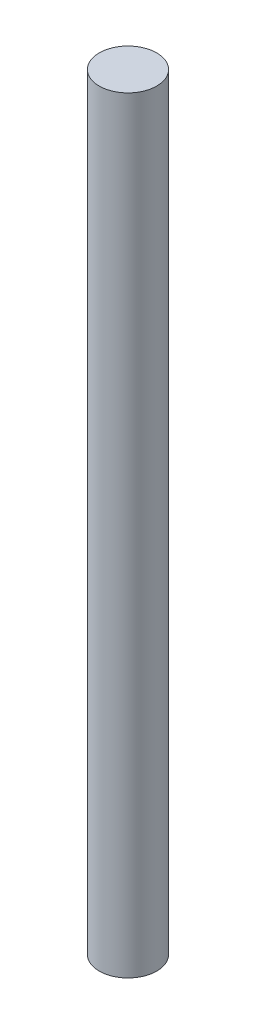
ISO-10303-21;
HEADER;
FILE_DESCRIPTION(('STEP AP214'),'2;1');
FILE_NAME('part.step','',(''),(''),'','','');
FILE_SCHEMA(('AUTOMOTIVE_DESIGN { 1 0 10303 214 1 1 1 1 }'));
ENDSEC;
DATA;
#1=APPLICATION_CONTEXT('core data for automotive mechanical design processes');
#2=APPLICATION_PROTOCOL_DEFINITION('international standard','automotive_design',2000,#1);
#3=PRODUCT_CONTEXT('',#1,'mechanical');
#4=PRODUCT('Part','Part','',(#3));
#5=PRODUCT_RELATED_PRODUCT_CATEGORY('part','',(#4));
#6=PRODUCT_DEFINITION_FORMATION('','',#4);
#7=PRODUCT_DEFINITION_CONTEXT('part definition',#1,'design');
#8=PRODUCT_DEFINITION('design','',#6,#7);
#9=PRODUCT_DEFINITION_SHAPE('','',#8);
#10=(LENGTH_UNIT() NAMED_UNIT(*) SI_UNIT(.MILLI.,.METRE.));
#11=(NAMED_UNIT(*) PLANE_ANGLE_UNIT() SI_UNIT($,.RADIAN.));
#12=(NAMED_UNIT(*) SI_UNIT($,.STERADIAN.) SOLID_ANGLE_UNIT());
#13=UNCERTAINTY_MEASURE_WITH_UNIT(LENGTH_MEASURE(1.E-05),#10,'distance_accuracy_value','');
#14=(GEOMETRIC_REPRESENTATION_CONTEXT(3) GLOBAL_UNCERTAINTY_ASSIGNED_CONTEXT((#13)) GLOBAL_UNIT_ASSIGNED_CONTEXT((#10,
#11,#12)) REPRESENTATION_CONTEXT('',''));
#15=CARTESIAN_POINT('',(0.,0.,0.));
#16=DIRECTION('',(0.,0.,1.));
#17=DIRECTION('',(1.,0.,0.));
#18=AXIS2_PLACEMENT_3D('',#15,#16,#17);
#19=CARTESIAN_POINT('',(0.,254.,0.));
#20=DIRECTION('',(0.,-1.,0.));
#21=DIRECTION('',(0.,0.,-1.));
#22=AXIS2_PLACEMENT_3D('',#19,#20,#21);
#23=CYLINDRICAL_SURFACE('',#22,9.525);
#24=CARTESIAN_POINT('',(0.,254.,0.));
#25=DIRECTION('',(0.,1.,0.));
#26=DIRECTION('',(0.,0.,1.));
#27=AXIS2_PLACEMENT_3D('',#24,#25,#26);
#28=CIRCLE('',#27,9.525);
#29=CARTESIAN_POINT('',(0.,254.,9.525));
#30=VERTEX_POINT('',#29);
#31=EDGE_CURVE('E10',#30,#30,#28,.T.);
#32=ORIENTED_EDGE('',*,*,#31,.F.);
#33=EDGE_LOOP('',(#32));
#34=FACE_BOUND('',#33,.T.);
#35=CARTESIAN_POINT('',(0.,0.,0.));
#36=DIRECTION('',(0.,1.,0.));
#37=DIRECTION('',(0.,0.,1.));
#38=AXIS2_PLACEMENT_3D('',#35,#36,#37);
#39=CIRCLE('',#38,9.525);
#40=CARTESIAN_POINT('',(0.,0.,9.525));
#41=VERTEX_POINT('',#40);
#42=EDGE_CURVE('E34',#41,#41,#39,.T.);
#43=ORIENTED_EDGE('',*,*,#42,.T.);
#44=EDGE_LOOP('',(#43));
#45=FACE_BOUND('',#44,.T.);
#46=ADVANCED_FACE('F31',(#34,#45),#23,.T.);
#47=CARTESIAN_POINT('',(0.,254.,0.));
#48=DIRECTION('',(0.,1.,0.));
#49=DIRECTION('',(0.,0.,1.));
#50=AXIS2_PLACEMENT_3D('',#47,#48,#49);
#51=PLANE('',#50);
#52=ORIENTED_EDGE('',*,*,#31,.T.);
#53=EDGE_LOOP('',(#52));
#54=FACE_BOUND('',#53,.T.);
#55=ADVANCED_FACE('F46',(#54),#51,.T.);
#56=CARTESIAN_POINT('',(0.,0.,0.));
#57=DIRECTION('',(0.,1.,0.));
#58=DIRECTION('',(0.,0.,1.));
#59=AXIS2_PLACEMENT_3D('',#56,#57,#58);
#60=PLANE('',#59);
#61=ORIENTED_EDGE('',*,*,#42,.F.);
#62=EDGE_LOOP('',(#61));
#63=FACE_BOUND('',#62,.T.);
#64=ADVANCED_FACE('F44',(#63),#60,.F.);
#65=CLOSED_SHELL('',(#46,#55,#64));
#66=MANIFOLD_SOLID_BREP('B2',#65);
#67=ADVANCED_BREP_SHAPE_REPRESENTATION('',(#18,#66),#14);
#68=SHAPE_DEFINITION_REPRESENTATION(#9,#67);
ENDSEC;
END-ISO-10303-21;
